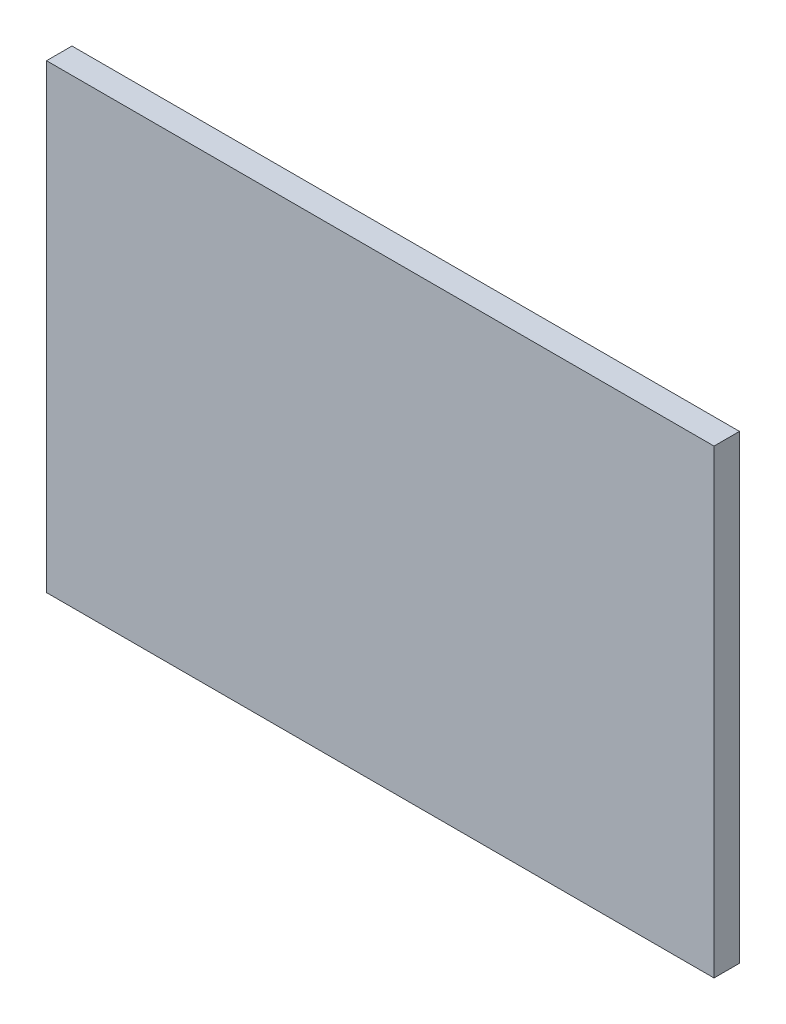
ISO-10303-21;
HEADER;
FILE_DESCRIPTION(('STEP AP214'),'2;1');
FILE_NAME('part.step','',(''),(''),'','','');
FILE_SCHEMA(('AUTOMOTIVE_DESIGN { 1 0 10303 214 1 1 1 1 }'));
ENDSEC;
DATA;
#1=APPLICATION_CONTEXT('core data for automotive mechanical design processes');
#2=APPLICATION_PROTOCOL_DEFINITION('international standard','automotive_design',2000,#1);
#3=PRODUCT_CONTEXT('',#1,'mechanical');
#4=PRODUCT('Part','Part','',(#3));
#5=PRODUCT_RELATED_PRODUCT_CATEGORY('part','',(#4));
#6=PRODUCT_DEFINITION_FORMATION('','',#4);
#7=PRODUCT_DEFINITION_CONTEXT('part definition',#1,'design');
#8=PRODUCT_DEFINITION('design','',#6,#7);
#9=PRODUCT_DEFINITION_SHAPE('','',#8);
#10=(LENGTH_UNIT() NAMED_UNIT(*) SI_UNIT(.MILLI.,.METRE.));
#11=(NAMED_UNIT(*) PLANE_ANGLE_UNIT() SI_UNIT($,.RADIAN.));
#12=(NAMED_UNIT(*) SI_UNIT($,.STERADIAN.) SOLID_ANGLE_UNIT());
#13=UNCERTAINTY_MEASURE_WITH_UNIT(LENGTH_MEASURE(1.E-05),#10,'distance_accuracy_value','');
#14=(GEOMETRIC_REPRESENTATION_CONTEXT(3) GLOBAL_UNCERTAINTY_ASSIGNED_CONTEXT((#13)) GLOBAL_UNIT_ASSIGNED_CONTEXT((#10,
#11,#12)) REPRESENTATION_CONTEXT('',''));
#15=CARTESIAN_POINT('',(0.,0.,0.));
#16=DIRECTION('',(0.,0.,1.));
#17=DIRECTION('',(1.,0.,0.));
#18=AXIS2_PLACEMENT_3D('',#15,#16,#17);
#19=CARTESIAN_POINT('',(-74.3493955522386,45.9068945538818,4.064));
#20=DIRECTION('',(1.,0.,0.));
#21=DIRECTION('',(0.,0.,-1.));
#22=AXIS2_PLACEMENT_3D('',#19,#20,#21);
#23=PLANE('',#22);
#24=DIRECTION('',(0.,-1.,0.));
#25=VECTOR('',#24,1.);
#26=CARTESIAN_POINT('',(-74.3493955522386,45.9068945538818,0.));
#27=LINE('',#26,#25);
#28=CARTESIAN_POINT('',(-74.3493955522386,45.9068945538818,0.));
#29=VERTEX_POINT('',#28);
#30=CARTESIAN_POINT('',(-74.3493955522386,-27.6442062572422,0.));
#31=VERTEX_POINT('',#30);
#32=EDGE_CURVE('E99',#29,#31,#27,.T.);
#33=ORIENTED_EDGE('',*,*,#32,.T.);
#34=DIRECTION('',(0.,0.,-1.));
#35=VECTOR('',#34,1.);
#36=CARTESIAN_POINT('',(-74.3493955522386,-27.6442062572422,4.064));
#37=LINE('',#36,#35);
#38=CARTESIAN_POINT('',(-74.3493955522386,-27.6442062572422,4.064));
#39=VERTEX_POINT('',#38);
#40=EDGE_CURVE('E11',#39,#31,#37,.T.);
#41=ORIENTED_EDGE('',*,*,#40,.F.);
#42=DIRECTION('',(0.,-1.,0.));
#43=VECTOR('',#42,1.);
#44=CARTESIAN_POINT('',(-74.3493955522386,45.9068945538818,4.064));
#45=LINE('',#44,#43);
#46=CARTESIAN_POINT('',(-74.3493955522386,45.9068945538818,4.064));
#47=VERTEX_POINT('',#46);
#48=EDGE_CURVE('E87',#47,#39,#45,.T.);
#49=ORIENTED_EDGE('',*,*,#48,.F.);
#50=DIRECTION('',(0.,0.,-1.));
#51=VECTOR('',#50,1.);
#52=CARTESIAN_POINT('',(-74.3493955522386,45.9068945538818,4.064));
#53=LINE('',#52,#51);
#54=EDGE_CURVE('E95',#47,#29,#53,.T.);
#55=ORIENTED_EDGE('',*,*,#54,.T.);
#56=EDGE_LOOP('',(#33,#41,#49,#55));
#57=FACE_BOUND('',#56,.T.);
#58=ADVANCED_FACE('F36',(#57),#23,.F.);
#59=CARTESIAN_POINT('',(-74.3493955522386,-27.6442062572422,4.064));
#60=DIRECTION('',(0.,1.,0.));
#61=DIRECTION('',(0.,0.,1.));
#62=AXIS2_PLACEMENT_3D('',#59,#60,#61);
#63=PLANE('',#62);
#64=DIRECTION('',(1.,0.,0.));
#65=VECTOR('',#64,1.);
#66=CARTESIAN_POINT('',(-74.3493955522386,-27.6442062572422,0.));
#67=LINE('',#66,#65);
#68=CARTESIAN_POINT('',(32.2246484802063,-27.6442062572422,0.));
#69=VERTEX_POINT('',#68);
#70=EDGE_CURVE('E91',#31,#69,#67,.T.);
#71=ORIENTED_EDGE('',*,*,#70,.T.);
#72=DIRECTION('',(0.,0.,-1.));
#73=VECTOR('',#72,1.);
#74=CARTESIAN_POINT('',(32.2246484802063,-27.6442062572422,4.064));
#75=LINE('',#74,#73);
#76=CARTESIAN_POINT('',(32.2246484802063,-27.6442062572422,4.064));
#77=VERTEX_POINT('',#76);
#78=EDGE_CURVE('E44',#77,#69,#75,.T.);
#79=ORIENTED_EDGE('',*,*,#78,.F.);
#80=DIRECTION('',(1.,0.,0.));
#81=VECTOR('',#80,1.);
#82=CARTESIAN_POINT('',(-74.3493955522386,-27.6442062572422,4.064));
#83=LINE('',#82,#81);
#84=EDGE_CURVE('E82',#39,#77,#83,.T.);
#85=ORIENTED_EDGE('',*,*,#84,.F.);
#86=ORIENTED_EDGE('',*,*,#40,.T.);
#87=EDGE_LOOP('',(#71,#79,#85,#86));
#88=FACE_BOUND('',#87,.T.);
#89=ADVANCED_FACE('F90',(#88),#63,.F.);
#90=CARTESIAN_POINT('',(32.2246484802063,45.9068945538818,4.064));
#91=DIRECTION('',(-1.,0.,0.));
#92=DIRECTION('',(0.,0.,1.));
#93=AXIS2_PLACEMENT_3D('',#90,#91,#92);
#94=PLANE('',#93);
#95=DIRECTION('',(0.,1.,0.));
#96=VECTOR('',#95,1.);
#97=CARTESIAN_POINT('',(32.2246484802063,45.9068945538818,0.));
#98=LINE('',#97,#96);
#99=CARTESIAN_POINT('',(32.2246484802063,45.9068945538818,0.));
#100=VERTEX_POINT('',#99);
#101=EDGE_CURVE('E69',#69,#100,#98,.T.);
#102=ORIENTED_EDGE('',*,*,#101,.T.);
#103=DIRECTION('',(0.,0.,-1.));
#104=VECTOR('',#103,1.);
#105=CARTESIAN_POINT('',(32.2246484802063,45.9068945538818,4.064));
#106=LINE('',#105,#104);
#107=CARTESIAN_POINT('',(32.2246484802063,45.9068945538818,4.064));
#108=VERTEX_POINT('',#107);
#109=EDGE_CURVE('E92',#108,#100,#106,.T.);
#110=ORIENTED_EDGE('',*,*,#109,.F.);
#111=DIRECTION('',(0.,1.,0.));
#112=VECTOR('',#111,1.);
#113=CARTESIAN_POINT('',(32.2246484802063,45.9068945538818,4.064));
#114=LINE('',#113,#112);
#115=EDGE_CURVE('E85',#77,#108,#114,.T.);
#116=ORIENTED_EDGE('',*,*,#115,.F.);
#117=ORIENTED_EDGE('',*,*,#78,.T.);
#118=EDGE_LOOP('',(#102,#110,#116,#117));
#119=FACE_BOUND('',#118,.T.);
#120=ADVANCED_FACE('F93',(#119),#94,.F.);
#121=CARTESIAN_POINT('',(-74.3493955522386,45.9068945538818,4.064));
#122=DIRECTION('',(0.,-1.,0.));
#123=DIRECTION('',(0.,0.,-1.));
#124=AXIS2_PLACEMENT_3D('',#121,#122,#123);
#125=PLANE('',#124);
#126=DIRECTION('',(-1.,0.,0.));
#127=VECTOR('',#126,1.);
#128=CARTESIAN_POINT('',(-74.3493955522386,45.9068945538818,0.));
#129=LINE('',#128,#127);
#130=EDGE_CURVE('E75',#100,#29,#129,.T.);
#131=ORIENTED_EDGE('',*,*,#130,.T.);
#132=ORIENTED_EDGE('',*,*,#54,.F.);
#133=DIRECTION('',(-1.,0.,0.));
#134=VECTOR('',#133,1.);
#135=CARTESIAN_POINT('',(-74.3493955522386,45.9068945538818,4.064));
#136=LINE('',#135,#134);
#137=EDGE_CURVE('E52',#108,#47,#136,.T.);
#138=ORIENTED_EDGE('',*,*,#137,.F.);
#139=ORIENTED_EDGE('',*,*,#109,.T.);
#140=EDGE_LOOP('',(#131,#132,#138,#139));
#141=FACE_BOUND('',#140,.T.);
#142=ADVANCED_FACE('F106',(#141),#125,.F.);
#143=CARTESIAN_POINT('',(0.,0.,4.064));
#144=DIRECTION('',(0.,0.,1.));
#145=DIRECTION('',(1.,0.,0.));
#146=AXIS2_PLACEMENT_3D('',#143,#144,#145);
#147=PLANE('',#146);
#148=ORIENTED_EDGE('',*,*,#48,.T.);
#149=ORIENTED_EDGE('',*,*,#84,.T.);
#150=ORIENTED_EDGE('',*,*,#115,.T.);
#151=ORIENTED_EDGE('',*,*,#137,.T.);
#152=EDGE_LOOP('',(#148,#149,#150,#151));
#153=FACE_BOUND('',#152,.T.);
#154=ADVANCED_FACE('F83',(#153),#147,.T.);
#155=CARTESIAN_POINT('',(0.,0.,0.));
#156=DIRECTION('',(0.,0.,1.));
#157=DIRECTION('',(1.,0.,0.));
#158=AXIS2_PLACEMENT_3D('',#155,#156,#157);
#159=PLANE('',#158);
#160=ORIENTED_EDGE('',*,*,#32,.F.);
#161=ORIENTED_EDGE('',*,*,#130,.F.);
#162=ORIENTED_EDGE('',*,*,#101,.F.);
#163=ORIENTED_EDGE('',*,*,#70,.F.);
#164=EDGE_LOOP('',(#160,#161,#162,#163));
#165=FACE_BOUND('',#164,.T.);
#166=ADVANCED_FACE('F109',(#165),#159,.F.);
#167=CLOSED_SHELL('',(#58,#89,#120,#142,#154,#166));
#168=MANIFOLD_SOLID_BREP('B2',#167);
#169=ADVANCED_BREP_SHAPE_REPRESENTATION('',(#18,#168),#14);
#170=SHAPE_DEFINITION_REPRESENTATION(#9,#169);
ENDSEC;
END-ISO-10303-21;
